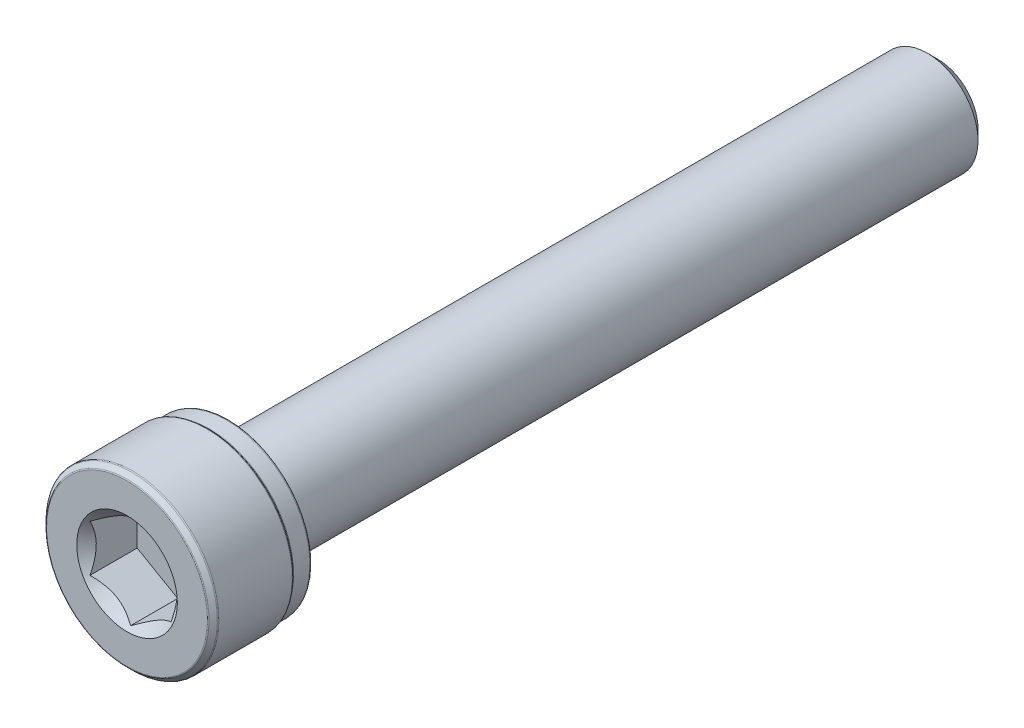
ISO-10303-21;
HEADER;
FILE_DESCRIPTION(('STEP AP214'),'2;1');
FILE_NAME('part.step','',(''),(''),'','','');
FILE_SCHEMA(('AUTOMOTIVE_DESIGN { 1 0 10303 214 1 1 1 1 }'));
ENDSEC;
DATA;
#1=APPLICATION_CONTEXT('core data for automotive mechanical design processes');
#2=APPLICATION_PROTOCOL_DEFINITION('international standard','automotive_design',2000,#1);
#3=PRODUCT_CONTEXT('',#1,'mechanical');
#4=PRODUCT('Part','Part','',(#3));
#5=PRODUCT_RELATED_PRODUCT_CATEGORY('part','',(#4));
#6=PRODUCT_DEFINITION_FORMATION('','',#4);
#7=PRODUCT_DEFINITION_CONTEXT('part definition',#1,'design');
#8=PRODUCT_DEFINITION('design','',#6,#7);
#9=PRODUCT_DEFINITION_SHAPE('','',#8);
#10=(LENGTH_UNIT() NAMED_UNIT(*) SI_UNIT(.MILLI.,.METRE.));
#11=(NAMED_UNIT(*) PLANE_ANGLE_UNIT() SI_UNIT($,.RADIAN.));
#12=(NAMED_UNIT(*) SI_UNIT($,.STERADIAN.) SOLID_ANGLE_UNIT());
#13=UNCERTAINTY_MEASURE_WITH_UNIT(LENGTH_MEASURE(1.E-05),#10,'distance_accuracy_value','');
#14=(GEOMETRIC_REPRESENTATION_CONTEXT(3) GLOBAL_UNCERTAINTY_ASSIGNED_CONTEXT((#13)) GLOBAL_UNIT_ASSIGNED_CONTEXT((#10,
#11,#12)) REPRESENTATION_CONTEXT('',''));
#15=CARTESIAN_POINT('',(0.,0.,0.));
#16=DIRECTION('',(0.,0.,1.));
#17=DIRECTION('',(1.,0.,0.));
#18=AXIS2_PLACEMENT_3D('',#15,#16,#17);
#19=CARTESIAN_POINT('',(0.,1.98038475772934,-20.));
#20=DIRECTION('',(0.,0.,-1.));
#21=DIRECTION('',(0.,1.,0.));
#22=AXIS2_PLACEMENT_3D('',#19,#20,#21);
#23=PLANE('',#22);
#24=CARTESIAN_POINT('',(0.,0.,-20.));
#25=DIRECTION('',(0.,0.,-1.));
#26=DIRECTION('',(0.,1.,0.));
#27=AXIS2_PLACEMENT_3D('',#24,#25,#26);
#28=CIRCLE('',#27,1.98038475772934);
#29=CARTESIAN_POINT('',(0.,1.98038475772934,-20.));
#30=VERTEX_POINT('',#29);
#31=EDGE_CURVE('E47',#30,#30,#28,.T.);
#32=ORIENTED_EDGE('',*,*,#31,.T.);
#33=EDGE_LOOP('',(#32));
#34=FACE_BOUND('',#33,.T.);
#35=ADVANCED_FACE('F34',(#34),#23,.T.);
#36=CARTESIAN_POINT('',(0.,0.,-20.));
#37=DIRECTION('',(0.,0.,1.));
#38=DIRECTION('',(0.,-1.,0.));
#39=AXIS2_PLACEMENT_3D('',#36,#37,#38);
#40=CONICAL_SURFACE('',#39,1.98038475772934,0.785398163397443);
#41=CARTESIAN_POINT('',(0.,0.,-19.4803847577293));
#42=DIRECTION('',(0.,0.,-1.));
#43=DIRECTION('',(0.,1.,0.));
#44=AXIS2_PLACEMENT_3D('',#41,#42,#43);
#45=CIRCLE('',#44,2.5);
#46=CARTESIAN_POINT('',(0.,2.5,-19.4803847577293));
#47=VERTEX_POINT('',#46);
#48=EDGE_CURVE('E153',#47,#47,#45,.T.);
#49=ORIENTED_EDGE('',*,*,#48,.T.);
#50=EDGE_LOOP('',(#49));
#51=FACE_BOUND('',#50,.T.);
#52=ORIENTED_EDGE('',*,*,#31,.F.);
#53=EDGE_LOOP('',(#52));
#54=FACE_BOUND('',#53,.T.);
#55=ADVANCED_FACE('F159',(#51,#54),#40,.T.);
#56=CARTESIAN_POINT('',(0.,0.,-20.));
#57=DIRECTION('',(0.,0.,-1.));
#58=DIRECTION('',(0.,1.,0.));
#59=AXIS2_PLACEMENT_3D('',#56,#57,#58);
#60=CYLINDRICAL_SURFACE('',#59,2.5);
#61=CARTESIAN_POINT('',(0.,0.,14.75));
#62=DIRECTION('',(0.,0.,-1.));
#63=DIRECTION('',(0.,1.,0.));
#64=AXIS2_PLACEMENT_3D('',#61,#62,#63);
#65=CIRCLE('',#64,2.5);
#66=CARTESIAN_POINT('',(0.,2.5,14.75));
#67=VERTEX_POINT('',#66);
#68=EDGE_CURVE('E150',#67,#67,#65,.T.);
#69=ORIENTED_EDGE('',*,*,#68,.T.);
#70=EDGE_LOOP('',(#69));
#71=FACE_BOUND('',#70,.T.);
#72=ORIENTED_EDGE('',*,*,#48,.F.);
#73=EDGE_LOOP('',(#72));
#74=FACE_BOUND('',#73,.T.);
#75=ADVANCED_FACE('F161',(#71,#74),#60,.T.);
#76=CARTESIAN_POINT('',(0.,0.,14.75));
#77=DIRECTION('',(0.,0.,-1.));
#78=DIRECTION('',(0.,1.,0.));
#79=AXIS2_PLACEMENT_3D('',#76,#77,#78);
#80=TOROIDAL_SURFACE('',#79,2.75,0.249999999999999);
#81=CARTESIAN_POINT('',(0.,0.,15.));
#82=DIRECTION('',(0.,0.,-1.));
#83=DIRECTION('',(0.,1.,0.));
#84=AXIS2_PLACEMENT_3D('',#81,#82,#83);
#85=CIRCLE('',#84,2.75);
#86=CARTESIAN_POINT('',(0.,2.75,15.));
#87=VERTEX_POINT('',#86);
#88=EDGE_CURVE('E147',#87,#87,#85,.T.);
#89=ORIENTED_EDGE('',*,*,#88,.T.);
#90=EDGE_LOOP('',(#89));
#91=FACE_BOUND('',#90,.T.);
#92=ORIENTED_EDGE('',*,*,#68,.F.);
#93=EDGE_LOOP('',(#92));
#94=FACE_BOUND('',#93,.T.);
#95=ADVANCED_FACE('F167',(#91,#94),#80,.F.);
#96=CARTESIAN_POINT('',(0.,4.01875,15.));
#97=DIRECTION('',(0.,0.,-1.));
#98=DIRECTION('',(0.,1.,0.));
#99=AXIS2_PLACEMENT_3D('',#96,#97,#98);
#100=PLANE('',#99);
#101=CARTESIAN_POINT('',(0.,0.,15.));
#102=DIRECTION('',(0.,0.,-1.));
#103=DIRECTION('',(0.,1.,0.));
#104=AXIS2_PLACEMENT_3D('',#101,#102,#103);
#105=CIRCLE('',#104,4.01875);
#106=CARTESIAN_POINT('',(0.,4.01875,15.));
#107=VERTEX_POINT('',#106);
#108=EDGE_CURVE('E144',#107,#107,#105,.T.);
#109=ORIENTED_EDGE('',*,*,#108,.T.);
#110=EDGE_LOOP('',(#109));
#111=FACE_BOUND('',#110,.T.);
#112=ORIENTED_EDGE('',*,*,#88,.F.);
#113=EDGE_LOOP('',(#112));
#114=FACE_BOUND('',#113,.T.);
#115=ADVANCED_FACE('F173',(#111,#114),#100,.T.);
#116=CARTESIAN_POINT('',(0.,0.,15.10625));
#117=DIRECTION('',(0.,0.,-1.));
#118=DIRECTION('',(0.,1.,0.));
#119=AXIS2_PLACEMENT_3D('',#116,#117,#118);
#120=TOROIDAL_SURFACE('',#119,4.01875,0.10625);
#121=CARTESIAN_POINT('',(0.,0.,15.10625));
#122=DIRECTION('',(0.,0.,-1.));
#123=DIRECTION('',(0.,1.,0.));
#124=AXIS2_PLACEMENT_3D('',#121,#122,#123);
#125=CIRCLE('',#124,4.125);
#126=CARTESIAN_POINT('',(0.,4.125,15.10625));
#127=VERTEX_POINT('',#126);
#128=EDGE_CURVE('E141',#127,#127,#125,.T.);
#129=ORIENTED_EDGE('',*,*,#128,.T.);
#130=EDGE_LOOP('',(#129));
#131=FACE_BOUND('',#130,.T.);
#132=ORIENTED_EDGE('',*,*,#108,.F.);
#133=EDGE_LOOP('',(#132));
#134=FACE_BOUND('',#133,.T.);
#135=ADVANCED_FACE('F177',(#131,#134),#120,.T.);
#136=CARTESIAN_POINT('',(0.,0.,-20.));
#137=DIRECTION('',(0.,0.,-1.));
#138=DIRECTION('',(0.,1.,0.));
#139=AXIS2_PLACEMENT_3D('',#136,#137,#138);
#140=CYLINDRICAL_SURFACE('',#139,4.125);
#141=CARTESIAN_POINT('',(0.,0.,15.9051395654396));
#142=DIRECTION('',(0.,0.,-1.));
#143=DIRECTION('',(0.,1.,0.));
#144=AXIS2_PLACEMENT_3D('',#141,#142,#143);
#145=CIRCLE('',#144,4.125);
#146=CARTESIAN_POINT('',(0.,4.125,15.9051395654396));
#147=VERTEX_POINT('',#146);
#148=EDGE_CURVE('E138',#147,#147,#145,.T.);
#149=ORIENTED_EDGE('',*,*,#148,.T.);
#150=EDGE_LOOP('',(#149));
#151=FACE_BOUND('',#150,.T.);
#152=ORIENTED_EDGE('',*,*,#128,.F.);
#153=EDGE_LOOP('',(#152));
#154=FACE_BOUND('',#153,.T.);
#155=ADVANCED_FACE('F181',(#151,#154),#140,.T.);
#156=CARTESIAN_POINT('',(0.,0.,15.9051395654396));
#157=DIRECTION('',(0.,0.,-1.));
#158=DIRECTION('',(0.,1.,0.));
#159=AXIS2_PLACEMENT_3D('',#156,#157,#158);
#160=TOROIDAL_SURFACE('',#159,4.203125,0.0781249999999984);
#161=CARTESIAN_POINT('',(0.,0.,15.9603822827198));
#162=DIRECTION('',(0.,0.,-1.));
#163=DIRECTION('',(0.,1.,0.));
#164=AXIS2_PLACEMENT_3D('',#161,#162,#163);
#165=CIRCLE('',#164,4.14788228271981);
#166=CARTESIAN_POINT('',(0.,4.14788228271981,15.9603822827198));
#167=VERTEX_POINT('',#166);
#168=EDGE_CURVE('E135',#167,#167,#165,.T.);
#169=ORIENTED_EDGE('',*,*,#168,.T.);
#170=EDGE_LOOP('',(#169));
#171=FACE_BOUND('',#170,.T.);
#172=ORIENTED_EDGE('',*,*,#148,.F.);
#173=EDGE_LOOP('',(#172));
#174=FACE_BOUND('',#173,.T.);
#175=ADVANCED_FACE('F185',(#171,#174),#160,.F.);
#176=CARTESIAN_POINT('',(0.,0.,15.9603822827198));
#177=DIRECTION('',(0.,0.,1.));
#178=DIRECTION('',(0.,-1.,0.));
#179=AXIS2_PLACEMENT_3D('',#176,#177,#178);
#180=CONICAL_SURFACE('',#179,4.14788228271981,0.785398163397405);
#181=CARTESIAN_POINT('',(0.,0.,16.0396177172802));
#182=DIRECTION('',(0.,0.,-1.));
#183=DIRECTION('',(0.,1.,0.));
#184=AXIS2_PLACEMENT_3D('',#181,#182,#183);
#185=CIRCLE('',#184,4.2271177172802);
#186=CARTESIAN_POINT('',(0.,4.2271177172802,16.0396177172802));
#187=VERTEX_POINT('',#186);
#188=EDGE_CURVE('E132',#187,#187,#185,.T.);
#189=ORIENTED_EDGE('',*,*,#188,.T.);
#190=EDGE_LOOP('',(#189));
#191=FACE_BOUND('',#190,.T.);
#192=ORIENTED_EDGE('',*,*,#168,.F.);
#193=EDGE_LOOP('',(#192));
#194=FACE_BOUND('',#193,.T.);
#195=ADVANCED_FACE('F189',(#191,#194),#180,.T.);
#196=CARTESIAN_POINT('',(0.,0.,16.0948604345604));
#197=DIRECTION('',(0.,0.,-1.));
#198=DIRECTION('',(0.,1.,0.));
#199=AXIS2_PLACEMENT_3D('',#196,#197,#198);
#200=TOROIDAL_SURFACE('',#199,4.171875,0.0781249999999984);
#201=CARTESIAN_POINT('',(0.,0.,16.0948604345604));
#202=DIRECTION('',(0.,0.,-1.));
#203=DIRECTION('',(0.,1.,0.));
#204=AXIS2_PLACEMENT_3D('',#201,#202,#203);
#205=CIRCLE('',#204,4.25);
#206=CARTESIAN_POINT('',(0.,4.25,16.0948604345604));
#207=VERTEX_POINT('',#206);
#208=EDGE_CURVE('E129',#207,#207,#205,.T.);
#209=ORIENTED_EDGE('',*,*,#208,.T.);
#210=EDGE_LOOP('',(#209));
#211=FACE_BOUND('',#210,.T.);
#212=ORIENTED_EDGE('',*,*,#188,.F.);
#213=EDGE_LOOP('',(#212));
#214=FACE_BOUND('',#213,.T.);
#215=ADVANCED_FACE('F193',(#211,#214),#200,.T.);
#216=CARTESIAN_POINT('',(0.,0.,-20.));
#217=DIRECTION('',(0.,0.,-1.));
#218=DIRECTION('',(0.,1.,0.));
#219=AXIS2_PLACEMENT_3D('',#216,#217,#218);
#220=CYLINDRICAL_SURFACE('',#219,4.25);
#221=CARTESIAN_POINT('',(0.,0.,19.7176395654396));
#222=DIRECTION('',(0.,0.,-1.));
#223=DIRECTION('',(0.,1.,0.));
#224=AXIS2_PLACEMENT_3D('',#221,#222,#223);
#225=CIRCLE('',#224,4.25);
#226=CARTESIAN_POINT('',(0.,4.25,19.7176395654396));
#227=VERTEX_POINT('',#226);
#228=EDGE_CURVE('E126',#227,#227,#225,.T.);
#229=ORIENTED_EDGE('',*,*,#228,.T.);
#230=EDGE_LOOP('',(#229));
#231=FACE_BOUND('',#230,.T.);
#232=ORIENTED_EDGE('',*,*,#208,.F.);
#233=EDGE_LOOP('',(#232));
#234=FACE_BOUND('',#233,.T.);
#235=ADVANCED_FACE('F197',(#231,#234),#220,.T.);
#236=CARTESIAN_POINT('',(0.,0.,19.7176395654396));
#237=DIRECTION('',(0.,0.,-1.));
#238=DIRECTION('',(0.,1.,0.));
#239=AXIS2_PLACEMENT_3D('',#236,#237,#238);
#240=TOROIDAL_SURFACE('',#239,4.171875,0.0781250000000014);
#241=CARTESIAN_POINT('',(0.,0.,19.7728822827198));
#242=DIRECTION('',(0.,0.,-1.));
#243=DIRECTION('',(0.,1.,0.));
#244=AXIS2_PLACEMENT_3D('',#241,#242,#243);
#245=CIRCLE('',#244,4.2271177172802);
#246=CARTESIAN_POINT('',(0.,4.2271177172802,19.7728822827198));
#247=VERTEX_POINT('',#246);
#248=EDGE_CURVE('E123',#247,#247,#245,.T.);
#249=ORIENTED_EDGE('',*,*,#248,.T.);
#250=EDGE_LOOP('',(#249));
#251=FACE_BOUND('',#250,.T.);
#252=ORIENTED_EDGE('',*,*,#228,.F.);
#253=EDGE_LOOP('',(#252));
#254=FACE_BOUND('',#253,.T.);
#255=ADVANCED_FACE('F201',(#251,#254),#240,.T.);
#256=CARTESIAN_POINT('',(0.,0.,19.7728822827198));
#257=DIRECTION('',(0.,0.,-1.));
#258=DIRECTION('',(0.,1.,0.));
#259=AXIS2_PLACEMENT_3D('',#256,#257,#258);
#260=CONICAL_SURFACE('',#259,4.2271177172802,0.785398163397474);
#261=CARTESIAN_POINT('',(0.,0.,19.9771177172802));
#262=DIRECTION('',(0.,0.,-1.));
#263=DIRECTION('',(0.,1.,0.));
#264=AXIS2_PLACEMENT_3D('',#261,#262,#263);
#265=CIRCLE('',#264,4.0228822827198);
#266=CARTESIAN_POINT('',(0.,4.0228822827198,19.9771177172802));
#267=VERTEX_POINT('',#266);
#268=EDGE_CURVE('E120',#267,#267,#265,.T.);
#269=ORIENTED_EDGE('',*,*,#268,.T.);
#270=EDGE_LOOP('',(#269));
#271=FACE_BOUND('',#270,.T.);
#272=ORIENTED_EDGE('',*,*,#248,.F.);
#273=EDGE_LOOP('',(#272));
#274=FACE_BOUND('',#273,.T.);
#275=ADVANCED_FACE('F205',(#271,#274),#260,.T.);
#276=CARTESIAN_POINT('',(0.,0.,19.921875));
#277=DIRECTION('',(0.,0.,-1.));
#278=DIRECTION('',(0.,1.,0.));
#279=AXIS2_PLACEMENT_3D('',#276,#277,#278);
#280=TOROIDAL_SURFACE('',#279,3.9676395654396,0.0781249999999981);
#281=CARTESIAN_POINT('',(0.,0.,20.));
#282=DIRECTION('',(0.,0.,-1.));
#283=DIRECTION('',(0.,1.,0.));
#284=AXIS2_PLACEMENT_3D('',#281,#282,#283);
#285=CIRCLE('',#284,3.9676395654396);
#286=CARTESIAN_POINT('',(0.,3.9676395654396,20.));
#287=VERTEX_POINT('',#286);
#288=EDGE_CURVE('E117',#287,#287,#285,.T.);
#289=ORIENTED_EDGE('',*,*,#288,.T.);
#290=EDGE_LOOP('',(#289));
#291=FACE_BOUND('',#290,.T.);
#292=ORIENTED_EDGE('',*,*,#268,.F.);
#293=EDGE_LOOP('',(#292));
#294=FACE_BOUND('',#293,.T.);
#295=ADVANCED_FACE('F209',(#291,#294),#280,.T.);
#296=CARTESIAN_POINT('',(0.,0.,20.));
#297=DIRECTION('',(0.,0.,1.));
#298=DIRECTION('',(0.,-1.,0.));
#299=AXIS2_PLACEMENT_3D('',#296,#297,#298);
#300=PLANE('',#299);
#301=CARTESIAN_POINT('',(0.,0.,20.));
#302=DIRECTION('',(0.,0.,1.));
#303=DIRECTION('',(1.,0.,0.));
#304=AXIS2_PLACEMENT_3D('',#301,#302,#303);
#305=CIRCLE('',#304,2.48260615751539);
#306=CARTESIAN_POINT('',(2.48260615751539,0.,20.));
#307=VERTEX_POINT('',#306);
#308=EDGE_CURVE('E303',#307,#307,#305,.T.);
#309=ORIENTED_EDGE('',*,*,#308,.F.);
#310=EDGE_LOOP('',(#309));
#311=FACE_BOUND('',#310,.T.);
#312=ORIENTED_EDGE('',*,*,#288,.F.);
#313=EDGE_LOOP('',(#312));
#314=FACE_BOUND('',#313,.T.);
#315=ADVANCED_FACE('F213',(#311,#314),#300,.T.);
#316=CARTESIAN_POINT('',(0.,0.,20.));
#317=DIRECTION('',(0.,0.,1.));
#318=DIRECTION('',(1.,0.,0.));
#319=AXIS2_PLACEMENT_3D('',#316,#317,#318);
#320=CONICAL_SURFACE('',#319,2.48260615751539,0.78539816339745);
#321=ORIENTED_EDGE('',*,*,#308,.T.);
#322=EDGE_LOOP('',(#321));
#323=FACE_BOUND('',#322,.T.);
#324=CARTESIAN_POINT('',(-2.00019999999999,-1.15458506832541,19.8269103979568));
#325=CARTESIAN_POINT('',(-1.93144696596929,-1.19427965103064,19.7872480094687));
#326=CARTESIAN_POINT('',(-1.86154425786448,-1.23463799837204,19.7499149015273));
#327=CARTESIAN_POINT('',(-1.71900475544956,-1.31693321846145,19.6815586043793));
#328=CARTESIAN_POINT('',(-1.64635440243464,-1.35887791933134,19.6505734529803));
#329=CARTESIAN_POINT('',(-1.49985839894603,-1.44345742638069,19.5974951357873));
#330=CARTESIAN_POINT('',(-1.4260500647537,-1.48607068799507,19.5752685464197));
#331=CARTESIAN_POINT('',(-1.27680836816473,-1.57223542169502,19.5410237359182));
#332=CARTESIAN_POINT('',(-1.20137956608185,-1.61578426088223,19.5289799483873));
#333=CARTESIAN_POINT('',(-1.07138449932892,-1.69083694766535,19.5181134311487));
#334=CARTESIAN_POINT('',(-1.01698621602989,-1.7222438111715,19.5165046728531));
#335=CARTESIAN_POINT('',(-0.908278544480305,-1.78500621460363,19.5192137968418));
#336=CARTESIAN_POINT('',(-0.85396919407866,-1.81636173267754,19.5235337570011));
#337=CARTESIAN_POINT('',(-0.745863272410661,-1.87877671565355,19.537854486653));
#338=CARTESIAN_POINT('',(-0.692067343445207,-1.90983580972306,19.5478616120051));
#339=CARTESIAN_POINT('',(-0.585405737694426,-1.97141691651547,19.5730073494928));
#340=CARTESIAN_POINT('',(-0.532539989929287,-2.00193897021858,19.5881455682854));
#341=CARTESIAN_POINT('',(-0.397120266910156,-2.08012358375726,19.6330894226723));
#342=CARTESIAN_POINT('',(-0.315406165150521,-2.12730124240478,19.6662837586689));
#343=CARTESIAN_POINT('',(-0.195252962742197,-2.19667172615922,19.7223207424145));
#344=CARTESIAN_POINT('',(-0.155657147890822,-2.21953238052244,19.7420096221901));
#345=CARTESIAN_POINT('',(-0.0771990411121269,-2.26483018959123,19.783182237608));
#346=CARTESIAN_POINT('',(-0.0383363164062586,-2.28726759416161,19.8046648708944));
#347=CARTESIAN_POINT('',(0.000200000000000734,-2.30951654681234,19.8269103979568));
#348=B_SPLINE_CURVE_WITH_KNOTS('',3,(#324,#325,#326,#327,#328,#329,#330,#331,#332,#333,#334,
#335,#336,#337,#338,#339,#340,#341,#342,#343,#344,#345,#346,#347),.UNSPECIFIED.,.F.,.F.,(4,2,2,
2,2,2,2,2,2,2,2,4),(0.,0.266420613771062,0.534393751523386,0.79811037437691,1.06116288956936,
1.24939906803721,1.43770123566247,1.62621426093931,1.81471283831913,2.11415604834144,
2.2634717071779,2.4126962696977),.UNSPECIFIED.);
#349=CARTESIAN_POINT('',(-1.99999999999999,-1.15470053837925,19.8267949192431));
#350=VERTEX_POINT('',#349);
#351=CARTESIAN_POINT('',(0.,-2.3094010767585,19.8267949192431));
#352=VERTEX_POINT('',#351);
#353=EDGE_CURVE('E101',#350,#352,#348,.T.);
#354=ORIENTED_EDGE('',*,*,#353,.F.);
#355=CARTESIAN_POINT('',(-1.99999999999999,-2.42398175579867,20.6599545105457));
#356=CARTESIAN_POINT('',(-1.99999999999999,-2.3654738763041,20.6148351758713));
#357=CARTESIAN_POINT('',(-1.99999999999999,-2.30665236661134,20.5701161756265));
#358=CARTESIAN_POINT('',(-1.99999999999999,-2.18825331969084,20.4816622121418));
#359=CARTESIAN_POINT('',(-1.99999999999999,-2.12867560822125,20.4379274823771));
#360=CARTESIAN_POINT('',(-1.99999999999999,-2.00820019262835,20.3513142462896));
#361=CARTESIAN_POINT('',(-1.99999999999999,-1.94729585350119,20.3084449389484));
#362=CARTESIAN_POINT('',(-1.99999999999999,-1.82447635639411,20.2241846501668));
#363=CARTESIAN_POINT('',(-1.99999999999999,-1.7625612682339,20.1827935672392));
#364=CARTESIAN_POINT('',(-1.99999999999999,-1.63352305153315,20.0992199648467));
#365=CARTESIAN_POINT('',(-1.99999999999999,-1.56632133333278,20.0571581799355));
#366=CARTESIAN_POINT('',(-1.99999999999999,-1.43035896394452,19.9756383889365));
#367=CARTESIAN_POINT('',(-1.99999999999999,-1.36159851701449,19.9361800443101));
#368=CARTESIAN_POINT('',(-1.99999999999999,-1.22246684398891,19.8606863637627));
#369=CARTESIAN_POINT('',(-1.99999999999999,-1.15210085009343,19.8246414605252));
#370=CARTESIAN_POINT('',(-1.99999999999999,-1.00937086384545,19.7567889383446));
#371=CARTESIAN_POINT('',(-1.99999999999999,-0.937007838648197,19.724979310286));
#372=CARTESIAN_POINT('',(-1.99999999999999,-0.797532850709091,19.6696918996687));
#373=CARTESIAN_POINT('',(-1.99999999999999,-0.730627867984566,19.6456972616385));
#374=CARTESIAN_POINT('',(-1.99999999999999,-0.595101218410186,19.6030621374066));
#375=CARTESIAN_POINT('',(-2.,-0.526479443554561,19.5844219889886));
#376=CARTESIAN_POINT('',(-2.,-0.389131528451129,19.5538205255166));
#377=CARTESIAN_POINT('',(-2.,-0.320433088583211,19.5417369815865));
#378=CARTESIAN_POINT('',(-2.,-0.182167175628635,19.5245029259217));
#379=CARTESIAN_POINT('',(-2.,-0.112599890436881,19.5193509405131));
#380=CARTESIAN_POINT('',(-2.,0.0235742388197043,19.5164261236486));
#381=CARTESIAN_POINT('',(-2.,0.0901742622543217,19.5183334186349));
#382=CARTESIAN_POINT('',(-2.,0.222860647279179,19.5286844259992));
#383=CARTESIAN_POINT('',(-2.,0.288946962142556,19.537128726115));
#384=CARTESIAN_POINT('',(-2.,0.421249515605841,19.5602169544548));
#385=CARTESIAN_POINT('',(-2.,0.487446247340618,19.574970869731));
#386=CARTESIAN_POINT('',(-2.,0.618375539180379,19.6098579982816));
#387=CARTESIAN_POINT('',(-2.,0.683108176846777,19.6299909258717));
#388=CARTESIAN_POINT('',(-2.,0.881750195572361,19.699485149858));
#389=CARTESIAN_POINT('',(-2.,1.01295821830486,19.7565400033525));
#390=CARTESIAN_POINT('',(-2.,1.26925973679031,19.8835183967961));
#391=CARTESIAN_POINT('',(-2.,1.39432972284544,19.9534871660011));
#392=CARTESIAN_POINT('',(-2.,1.57512870977373,20.0627644548654));
#393=CARTESIAN_POINT('',(-2.,1.63281357796871,20.0989012241787));
#394=CARTESIAN_POINT('',(-2.,1.74719269140407,20.1727216099303));
#395=CARTESIAN_POINT('',(-2.,1.80388686201492,20.2104053421917));
#396=CARTESIAN_POINT('',(-2.,1.91595826038668,20.2867305219709));
#397=CARTESIAN_POINT('',(-2.,1.97134240267411,20.3253618677048));
#398=CARTESIAN_POINT('',(-2.,2.08135060816027,20.4036615543687));
#399=CARTESIAN_POINT('',(-2.,2.13597487670731,20.4433296064566));
#400=CARTESIAN_POINT('',(-2.,2.19028039622781,20.4834228737147));
#401=B_SPLINE_CURVE_WITH_KNOTS('',3,(#355,#356,#357,#358,#359,#360,#361,#362,#363,#364,#365,
#366,#367,#368,#369,#370,#371,#372,#373,#374,#375,#376,#377,#378,#379,#380,#381,#382,#383,#384,
#385,#386,#387,#388,#389,#390,#391,#392,#393,#394,#395,#396,#397,#398,#399,#400),.UNSPECIFIED.,
.F.,.F.,(4,2,2,2,2,2,2,2,2,2,2,2,2,2,2,2,2,2,2,2,2,2,4),(0.,0.22165766710034,0.443367370127321,
0.666786125723381,0.890189512941436,1.12798201434515,1.36574353320623,1.60281759521649,
1.83977879106022,2.05282811904837,2.26589088413716,2.47483185958036,2.68372840641277,
2.88327763021217,3.08284479743511,3.2860424244889,3.48922926167213,3.91721633282415,
4.34673183999752,4.55091998635567,4.75512344852469,4.95768958131485,5.16019986543558),.UNSPECIFIED.);
#402=CARTESIAN_POINT('',(-2.,1.15470053837925,19.8267949192431));
#403=VERTEX_POINT('',#402);
#404=EDGE_CURVE('E259',#403,#350,#401,.F.);
#405=ORIENTED_EDGE('',*,*,#404,.F.);
#406=CARTESIAN_POINT('',(0.000200000000000542,2.30951654681234,19.8269103979568));
#407=CARTESIAN_POINT('',(-0.0685530340307045,2.2698219641071,19.7872480094687));
#408=CARTESIAN_POINT('',(-0.13845574213551,2.22946361676571,19.7499149015273));
#409=CARTESIAN_POINT('',(-0.280995244550436,2.1471683966763,19.6815586043793));
#410=CARTESIAN_POINT('',(-0.353645597565358,2.10522369580641,19.6505734529803));
#411=CARTESIAN_POINT('',(-0.50014160105397,2.02064418875706,19.5974951357873));
#412=CARTESIAN_POINT('',(-0.573949935246293,1.97803092714268,19.5752685464197));
#413=CARTESIAN_POINT('',(-0.723191631835262,1.89186619344272,19.5410237359182));
#414=CARTESIAN_POINT('',(-0.79862043391815,1.84831735425552,19.5289799483873));
#415=CARTESIAN_POINT('',(-0.928615500671077,1.77326466747239,19.5181134311487));
#416=CARTESIAN_POINT('',(-0.983013783970106,1.74185780396624,19.5165046728531));
#417=CARTESIAN_POINT('',(-1.09172145551969,1.67909540053411,19.5192137968418));
#418=CARTESIAN_POINT('',(-1.14603080592134,1.64773988246021,19.5235337570011));
#419=CARTESIAN_POINT('',(-1.25413672758934,1.5853248994842,19.537854486653));
#420=CARTESIAN_POINT('',(-1.30793265655479,1.55426580541469,19.5478616120051));
#421=CARTESIAN_POINT('',(-1.41459426230557,1.49268469862228,19.5730073494928));
#422=CARTESIAN_POINT('',(-1.46746001007071,1.46216264491916,19.5881455682854));
#423=CARTESIAN_POINT('',(-1.60287973308984,1.38397803138048,19.6330894226723));
#424=CARTESIAN_POINT('',(-1.68459383484948,1.33680037273297,19.6662837586689));
#425=CARTESIAN_POINT('',(-1.8047470372578,1.26742988897853,19.7223207424145));
#426=CARTESIAN_POINT('',(-1.84434285210917,1.2445692346153,19.7420096221901));
#427=CARTESIAN_POINT('',(-1.92280095888787,1.19927142554652,19.783182237608));
#428=CARTESIAN_POINT('',(-1.96166368359374,1.17683402097614,19.8046648708944));
#429=CARTESIAN_POINT('',(-2.0002,1.15458506832541,19.8269103979568));
#430=B_SPLINE_CURVE_WITH_KNOTS('',3,(#406,#407,#408,#409,#410,#411,#412,#413,#414,#415,#416,
#417,#418,#419,#420,#421,#422,#423,#424,#425,#426,#427,#428,#429),.UNSPECIFIED.,.F.,.F.,(4,2,2,
2,2,2,2,2,2,2,2,4),(0.,0.266420613771063,0.534393751523387,0.798110374376912,1.06116288956936,
1.24939906803721,1.43770123566247,1.62621426093931,1.81471283831913,2.11415604834144,
2.2634717071779,2.4126962696977),.UNSPECIFIED.);
#431=CARTESIAN_POINT('',(0.,2.3094010767585,19.8267949192431));
#432=VERTEX_POINT('',#431);
#433=EDGE_CURVE('E253',#432,#403,#430,.T.);
#434=ORIENTED_EDGE('',*,*,#433,.F.);
#435=CARTESIAN_POINT('',(2.0002,1.15458506832541,19.8269103979568));
#436=CARTESIAN_POINT('',(1.9314469659693,1.19427965103064,19.7872480094687));
#437=CARTESIAN_POINT('',(1.86154425786449,1.23463799837204,19.7499149015273));
#438=CARTESIAN_POINT('',(1.71900475544956,1.31693321846145,19.6815586043793));
#439=CARTESIAN_POINT('',(1.64635440243464,1.35887791933133,19.6505734529803));
#440=CARTESIAN_POINT('',(1.49985839894603,1.44345742638069,19.5974951357873));
#441=CARTESIAN_POINT('',(1.42605006475371,1.48607068799506,19.5752685464197));
#442=CARTESIAN_POINT('',(1.27680836816474,1.57223542169502,19.5410237359182));
#443=CARTESIAN_POINT('',(1.20137956608185,1.61578426088223,19.5289799483873));
#444=CARTESIAN_POINT('',(1.07138449932892,1.69083694766536,19.5181134311487));
#445=CARTESIAN_POINT('',(1.01698621602989,1.7222438111715,19.5165046728531));
#446=CARTESIAN_POINT('',(0.908278544480305,1.78500621460363,19.5192137968418));
#447=CARTESIAN_POINT('',(0.853969194078659,1.81636173267754,19.5235337570011));
#448=CARTESIAN_POINT('',(0.74586327241066,1.87877671565355,19.537854486653));
#449=CARTESIAN_POINT('',(0.692067343445207,1.90983580972306,19.5478616120051));
#450=CARTESIAN_POINT('',(0.585405737694425,1.97141691651547,19.5730073494928));
#451=CARTESIAN_POINT('',(0.532539989929286,2.00193897021859,19.5881455682854));
#452=CARTESIAN_POINT('',(0.397120266910155,2.08012358375726,19.6330894226723));
#453=CARTESIAN_POINT('',(0.315406165150521,2.12730124240478,19.6662837586689));
#454=CARTESIAN_POINT('',(0.195252962742197,2.19667172615922,19.7223207424145));
#455=CARTESIAN_POINT('',(0.155657147890822,2.21953238052244,19.7420096221901));
#456=CARTESIAN_POINT('',(0.077199041112128,2.26483018959123,19.783182237608));
#457=CARTESIAN_POINT('',(0.0383363164062604,2.28726759416161,19.8046648708944));
#458=CARTESIAN_POINT('',(-0.00019999999999857,2.30951654681234,19.8269103979568));
#459=B_SPLINE_CURVE_WITH_KNOTS('',3,(#435,#436,#437,#438,#439,#440,#441,#442,#443,#444,#445,
#446,#447,#448,#449,#450,#451,#452,#453,#454,#455,#456,#457,#458),.UNSPECIFIED.,.F.,.F.,(4,2,2,
2,2,2,2,2,2,2,2,4),(0.,0.266420613771063,0.534393751523388,0.798110374376914,1.06116288956937,
1.24939906803722,1.43770123566248,1.62621426093932,1.81471283831913,2.11415604834145,
2.2634717071779,2.4126962696977),.UNSPECIFIED.);
#460=CARTESIAN_POINT('',(2.,1.15470053837925,19.8267949192431));
#461=VERTEX_POINT('',#460);
#462=EDGE_CURVE('E54',#461,#432,#459,.T.);
#463=ORIENTED_EDGE('',*,*,#462,.F.);
#464=CARTESIAN_POINT('',(2.,-2.42398175579867,20.6599545105457));
#465=CARTESIAN_POINT('',(2.,-2.36547387630409,20.6148351758713));
#466=CARTESIAN_POINT('',(2.,-2.30665236661134,20.5701161756265));
#467=CARTESIAN_POINT('',(2.,-2.18825331969083,20.4816622121418));
#468=CARTESIAN_POINT('',(2.,-2.12867560822124,20.4379274823771));
#469=CARTESIAN_POINT('',(2.,-2.00820019262834,20.3513142462896));
#470=CARTESIAN_POINT('',(2.,-1.94729585350118,20.3084449389484));
#471=CARTESIAN_POINT('',(2.,-1.82447635639411,20.2241846501668));
#472=CARTESIAN_POINT('',(2.,-1.7625612682339,20.1827935672392));
#473=CARTESIAN_POINT('',(2.,-1.63352305153314,20.0992199648467));
#474=CARTESIAN_POINT('',(2.,-1.56632133333277,20.0571581799355));
#475=CARTESIAN_POINT('',(2.,-1.43035896394452,19.9756383889365));
#476=CARTESIAN_POINT('',(2.,-1.36159851701449,19.9361800443101));
#477=CARTESIAN_POINT('',(2.,-1.22246684398891,19.8606863637627));
#478=CARTESIAN_POINT('',(2.,-1.15210085009343,19.8246414605252));
#479=CARTESIAN_POINT('',(2.,-1.00937086384545,19.7567889383447));
#480=CARTESIAN_POINT('',(2.,-0.937007838648193,19.724979310286));
#481=CARTESIAN_POINT('',(2.,-0.797532850709088,19.6696918996687));
#482=CARTESIAN_POINT('',(2.,-0.730627867984562,19.6456972616385));
#483=CARTESIAN_POINT('',(2.,-0.595101218410182,19.6030621374066));
#484=CARTESIAN_POINT('',(2.,-0.526479443554558,19.5844219889886));
#485=CARTESIAN_POINT('',(2.,-0.389131528451127,19.5538205255166));
#486=CARTESIAN_POINT('',(2.,-0.320433088583209,19.5417369815865));
#487=CARTESIAN_POINT('',(2.,-0.182167175628632,19.5245029259217));
#488=CARTESIAN_POINT('',(2.,-0.112599890436879,19.5193509405131));
#489=CARTESIAN_POINT('',(2.,0.0235742388197073,19.5164261236486));
#490=CARTESIAN_POINT('',(2.,0.090174262254325,19.5183334186349));
#491=CARTESIAN_POINT('',(2.,0.222860647279182,19.5286844259992));
#492=CARTESIAN_POINT('',(2.,0.288946962142559,19.537128726115));
#493=CARTESIAN_POINT('',(2.,0.421249515605844,19.5602169544548));
#494=CARTESIAN_POINT('',(2.,0.487446247340621,19.574970869731));
#495=CARTESIAN_POINT('',(2.,0.618375539180382,19.6098579982816));
#496=CARTESIAN_POINT('',(2.,0.68310817684678,19.6299909258717));
#497=CARTESIAN_POINT('',(2.,0.881750195572363,19.699485149858));
#498=CARTESIAN_POINT('',(2.,1.01295821830486,19.7565400033525));
#499=CARTESIAN_POINT('',(2.,1.26925973679032,19.8835183967961));
#500=CARTESIAN_POINT('',(2.,1.39432972284545,19.9534871660011));
#501=CARTESIAN_POINT('',(2.,1.57512870977373,20.0627644548654));
#502=CARTESIAN_POINT('',(2.,1.63281357796872,20.0989012241787));
#503=CARTESIAN_POINT('',(2.,1.74719269140407,20.1727216099303));
#504=CARTESIAN_POINT('',(2.,1.80388686201493,20.2104053421917));
#505=CARTESIAN_POINT('',(2.,1.91595826038669,20.2867305219709));
#506=CARTESIAN_POINT('',(2.,1.97134240267412,20.3253618677048));
#507=CARTESIAN_POINT('',(2.,2.08135060816028,20.4036615543687));
#508=CARTESIAN_POINT('',(2.,2.13597487670732,20.4433296064566));
#509=CARTESIAN_POINT('',(2.,2.19028039622782,20.4834228737147));
#510=B_SPLINE_CURVE_WITH_KNOTS('',3,(#464,#465,#466,#467,#468,#469,#470,#471,#472,#473,#474,
#475,#476,#477,#478,#479,#480,#481,#482,#483,#484,#485,#486,#487,#488,#489,#490,#491,#492,#493,
#494,#495,#496,#497,#498,#499,#500,#501,#502,#503,#504,#505,#506,#507,#508,#509),.UNSPECIFIED.,
.F.,.F.,(4,2,2,2,2,2,2,2,2,2,2,2,2,2,2,2,2,2,2,2,2,2,4),(0.,0.22165766710034,0.443367370127321,
0.666786125723381,0.890189512941437,1.12798201434514,1.36574353320623,1.60281759521648,
1.83977879106022,2.05282811904837,2.26589088413716,2.47483185958035,2.68372840641276,
2.88327763021217,3.08284479743511,3.2860424244889,3.48922926167212,3.91721633282414,
4.34673183999751,4.55091998635567,4.75512344852469,4.95768958131485,5.16019986543558),.UNSPECIFIED.);
#511=CARTESIAN_POINT('',(2.,-1.15470053837925,19.8267949192431));
#512=VERTEX_POINT('',#511);
#513=EDGE_CURVE('E12',#512,#461,#510,.T.);
#514=ORIENTED_EDGE('',*,*,#513,.F.);
#515=CARTESIAN_POINT('',(-0.000199999999999496,-2.30951654681234,19.8269103979568));
#516=CARTESIAN_POINT('',(0.0685530340307065,-2.26982196410711,19.7872480094687));
#517=CARTESIAN_POINT('',(0.138455742135512,-2.22946361676571,19.7499149015273));
#518=CARTESIAN_POINT('',(0.280995244550437,-2.1471683966763,19.6815586043793));
#519=CARTESIAN_POINT('',(0.353645597565358,-2.10522369580641,19.6505734529803));
#520=CARTESIAN_POINT('',(0.500141601053971,-2.02064418875706,19.5974951357873));
#521=CARTESIAN_POINT('',(0.573949935246294,-1.97803092714268,19.5752685464197));
#522=CARTESIAN_POINT('',(0.723191631835264,-1.89186619344273,19.5410237359182));
#523=CARTESIAN_POINT('',(0.798620433918152,-1.84831735425552,19.5289799483873));
#524=CARTESIAN_POINT('',(0.928615500671079,-1.77326466747239,19.5181134311487));
#525=CARTESIAN_POINT('',(0.983013783970108,-1.74185780396624,19.5165046728531));
#526=CARTESIAN_POINT('',(1.09172145551969,-1.67909540053411,19.5192137968418));
#527=CARTESIAN_POINT('',(1.14603080592134,-1.64773988246021,19.5235337570011));
#528=CARTESIAN_POINT('',(1.25413672758934,-1.5853248994842,19.537854486653));
#529=CARTESIAN_POINT('',(1.30793265655479,-1.55426580541469,19.5478616120051));
#530=CARTESIAN_POINT('',(1.41459426230557,-1.49268469862228,19.5730073494928));
#531=CARTESIAN_POINT('',(1.46746001007071,-1.46216264491916,19.5881455682854));
#532=CARTESIAN_POINT('',(1.60287973308984,-1.38397803138048,19.6330894226723));
#533=CARTESIAN_POINT('',(1.68459383484948,-1.33680037273297,19.6662837586689));
#534=CARTESIAN_POINT('',(1.8047470372578,-1.26742988897853,19.7223207424145));
#535=CARTESIAN_POINT('',(1.84434285210918,-1.2445692346153,19.7420096221901));
#536=CARTESIAN_POINT('',(1.92280095888787,-1.19927142554652,19.783182237608));
#537=CARTESIAN_POINT('',(1.96166368359374,-1.17683402097614,19.8046648708944));
#538=CARTESIAN_POINT('',(2.0002,-1.15458506832541,19.8269103979568));
#539=B_SPLINE_CURVE_WITH_KNOTS('',3,(#515,#516,#517,#518,#519,#520,#521,#522,#523,#524,#525,
#526,#527,#528,#529,#530,#531,#532,#533,#534,#535,#536,#537,#538),.UNSPECIFIED.,.F.,.F.,(4,2,2,
2,2,2,2,2,2,2,2,4),(0.,0.266420613771064,0.534393751523388,0.798110374376914,1.06116288956936,
1.24939906803722,1.43770123566247,1.62621426093931,1.81471283831913,2.11415604834145,
2.2634717071779,2.41269626969771),.UNSPECIFIED.);
#540=EDGE_CURVE('E92',#352,#512,#539,.T.);
#541=ORIENTED_EDGE('',*,*,#540,.F.);
#542=EDGE_LOOP('',(#354,#405,#434,#463,#514,#541));
#543=FACE_BOUND('',#542,.T.);
#544=ADVANCED_FACE('F91',(#323,#543),#320,.F.);
#545=CARTESIAN_POINT('',(0.,0.,17.5));
#546=DIRECTION('',(0.,0.,1.));
#547=DIRECTION('',(1.,0.,0.));
#548=AXIS2_PLACEMENT_3D('',#545,#546,#547);
#549=PLANE('',#548);
#550=DIRECTION('',(0.866025403784438,0.5,0.));
#551=VECTOR('',#550,1.);
#552=CARTESIAN_POINT('',(0.,-2.3094010767585,17.5));
#553=LINE('',#552,#551);
#554=CARTESIAN_POINT('',(0.,-2.3094010767585,17.5));
#555=VERTEX_POINT('',#554);
#556=CARTESIAN_POINT('',(2.,-1.15470053837925,17.5));
#557=VERTEX_POINT('',#556);
#558=EDGE_CURVE('E100',#555,#557,#553,.T.);
#559=ORIENTED_EDGE('',*,*,#558,.T.);
#560=DIRECTION('',(0.,1.,0.));
#561=VECTOR('',#560,1.);
#562=CARTESIAN_POINT('',(2.,-1.15470053837925,17.5));
#563=LINE('',#562,#561);
#564=CARTESIAN_POINT('',(2.,1.15470053837925,17.5));
#565=VERTEX_POINT('',#564);
#566=EDGE_CURVE('E105',#557,#565,#563,.T.);
#567=ORIENTED_EDGE('',*,*,#566,.T.);
#568=DIRECTION('',(-0.866025403784439,0.499999999999999,0.));
#569=VECTOR('',#568,1.);
#570=CARTESIAN_POINT('',(2.,1.15470053837925,17.5));
#571=LINE('',#570,#569);
#572=CARTESIAN_POINT('',(0.,2.3094010767585,17.5));
#573=VERTEX_POINT('',#572);
#574=EDGE_CURVE('E285',#565,#573,#571,.T.);
#575=ORIENTED_EDGE('',*,*,#574,.T.);
#576=DIRECTION('',(-0.866025403784439,-0.5,0.));
#577=VECTOR('',#576,1.);
#578=CARTESIAN_POINT('',(0.,2.3094010767585,17.5));
#579=LINE('',#578,#577);
#580=CARTESIAN_POINT('',(-2.,1.15470053837925,17.5));
#581=VERTEX_POINT('',#580);
#582=EDGE_CURVE('E289',#573,#581,#579,.T.);
#583=ORIENTED_EDGE('',*,*,#582,.T.);
#584=DIRECTION('',(0.,-1.,0.));
#585=VECTOR('',#584,1.);
#586=CARTESIAN_POINT('',(-2.,1.15470053837925,17.5));
#587=LINE('',#586,#585);
#588=CARTESIAN_POINT('',(-1.99999999999999,-1.15470053837925,17.5));
#589=VERTEX_POINT('',#588);
#590=EDGE_CURVE('E113',#581,#589,#587,.T.);
#591=ORIENTED_EDGE('',*,*,#590,.T.);
#592=DIRECTION('',(0.866025403784439,-0.5,0.));
#593=VECTOR('',#592,1.);
#594=CARTESIAN_POINT('',(-1.99999999999999,-1.15470053837925,17.5));
#595=LINE('',#594,#593);
#596=EDGE_CURVE('E108',#589,#555,#595,.T.);
#597=ORIENTED_EDGE('',*,*,#596,.T.);
#598=EDGE_LOOP('',(#559,#567,#575,#583,#591,#597));
#599=FACE_BOUND('',#598,.T.);
#600=ADVANCED_FACE('F239',(#599),#549,.T.);
#601=CARTESIAN_POINT('',(2.,-1.15470053837925,17.5));
#602=DIRECTION('',(1.,0.,0.));
#603=DIRECTION('',(0.,0.,-1.));
#604=AXIS2_PLACEMENT_3D('',#601,#602,#603);
#605=PLANE('',#604);
#606=DIRECTION('',(0.,0.,1.));
#607=VECTOR('',#606,1.);
#608=CARTESIAN_POINT('',(2.,-1.15470053837925,17.5));
#609=LINE('',#608,#607);
#610=EDGE_CURVE('E98',#557,#512,#609,.T.);
#611=ORIENTED_EDGE('',*,*,#610,.T.);
#612=ORIENTED_EDGE('',*,*,#513,.T.);
#613=DIRECTION('',(0.,0.,1.));
#614=VECTOR('',#613,1.);
#615=CARTESIAN_POINT('',(2.,1.15470053837925,17.5));
#616=LINE('',#615,#614);
#617=EDGE_CURVE('E107',#565,#461,#616,.T.);
#618=ORIENTED_EDGE('',*,*,#617,.F.);
#619=ORIENTED_EDGE('',*,*,#566,.F.);
#620=EDGE_LOOP('',(#611,#612,#618,#619));
#621=FACE_BOUND('',#620,.T.);
#622=ADVANCED_FACE('F103',(#621),#605,.F.);
#623=CARTESIAN_POINT('',(2.,1.15470053837925,17.5));
#624=DIRECTION('',(0.5,0.866025403784439,0.));
#625=DIRECTION('',(-0.866025403784439,0.5,0.));
#626=AXIS2_PLACEMENT_3D('',#623,#624,#625);
#627=PLANE('',#626);
#628=ORIENTED_EDGE('',*,*,#617,.T.);
#629=ORIENTED_EDGE('',*,*,#462,.T.);
#630=DIRECTION('',(0.,0.,1.));
#631=VECTOR('',#630,1.);
#632=CARTESIAN_POINT('',(0.,2.3094010767585,17.5));
#633=LINE('',#632,#631);
#634=EDGE_CURVE('E110',#573,#432,#633,.T.);
#635=ORIENTED_EDGE('',*,*,#634,.F.);
#636=ORIENTED_EDGE('',*,*,#574,.F.);
#637=EDGE_LOOP('',(#628,#629,#635,#636));
#638=FACE_BOUND('',#637,.T.);
#639=ADVANCED_FACE('F274',(#638),#627,.F.);
#640=CARTESIAN_POINT('',(0.,2.3094010767585,17.5));
#641=DIRECTION('',(-0.5,0.866025403784439,0.));
#642=DIRECTION('',(-0.866025403784439,-0.5,0.));
#643=AXIS2_PLACEMENT_3D('',#640,#641,#642);
#644=PLANE('',#643);
#645=ORIENTED_EDGE('',*,*,#634,.T.);
#646=ORIENTED_EDGE('',*,*,#433,.T.);
#647=DIRECTION('',(0.,0.,1.));
#648=VECTOR('',#647,1.);
#649=CARTESIAN_POINT('',(-2.,1.15470053837925,17.5));
#650=LINE('',#649,#648);
#651=EDGE_CURVE('E299',#581,#403,#650,.T.);
#652=ORIENTED_EDGE('',*,*,#651,.F.);
#653=ORIENTED_EDGE('',*,*,#582,.F.);
#654=EDGE_LOOP('',(#645,#646,#652,#653));
#655=FACE_BOUND('',#654,.T.);
#656=ADVANCED_FACE('F269',(#655),#644,.F.);
#657=CARTESIAN_POINT('',(-2.,1.15470053837925,17.5));
#658=DIRECTION('',(-1.,0.,0.));
#659=DIRECTION('',(0.,-1.,0.));
#660=AXIS2_PLACEMENT_3D('',#657,#658,#659);
#661=PLANE('',#660);
#662=ORIENTED_EDGE('',*,*,#651,.T.);
#663=ORIENTED_EDGE('',*,*,#404,.T.);
#664=DIRECTION('',(0.,0.,1.));
#665=VECTOR('',#664,1.);
#666=CARTESIAN_POINT('',(-1.99999999999999,-1.15470053837925,17.5));
#667=LINE('',#666,#665);
#668=EDGE_CURVE('E296',#589,#350,#667,.T.);
#669=ORIENTED_EDGE('',*,*,#668,.F.);
#670=ORIENTED_EDGE('',*,*,#590,.F.);
#671=EDGE_LOOP('',(#662,#663,#669,#670));
#672=FACE_BOUND('',#671,.T.);
#673=ADVANCED_FACE('F266',(#672),#661,.F.);
#674=CARTESIAN_POINT('',(-1.99999999999999,-1.15470053837925,17.5));
#675=DIRECTION('',(-0.5,-0.866025403784439,0.));
#676=DIRECTION('',(0.866025403784439,-0.5,0.));
#677=AXIS2_PLACEMENT_3D('',#674,#675,#676);
#678=PLANE('',#677);
#679=ORIENTED_EDGE('',*,*,#668,.T.);
#680=ORIENTED_EDGE('',*,*,#353,.T.);
#681=DIRECTION('',(0.,0.,1.));
#682=VECTOR('',#681,1.);
#683=CARTESIAN_POINT('',(0.,-2.3094010767585,17.5));
#684=LINE('',#683,#682);
#685=EDGE_CURVE('E61',#555,#352,#684,.T.);
#686=ORIENTED_EDGE('',*,*,#685,.F.);
#687=ORIENTED_EDGE('',*,*,#596,.F.);
#688=EDGE_LOOP('',(#679,#680,#686,#687));
#689=FACE_BOUND('',#688,.T.);
#690=ADVANCED_FACE('F220',(#689),#678,.F.);
#691=CARTESIAN_POINT('',(0.,-2.3094010767585,17.5));
#692=DIRECTION('',(0.5,-0.866025403784438,0.));
#693=DIRECTION('',(0.866025403784438,0.5,0.));
#694=AXIS2_PLACEMENT_3D('',#691,#692,#693);
#695=PLANE('',#694);
#696=ORIENTED_EDGE('',*,*,#685,.T.);
#697=ORIENTED_EDGE('',*,*,#540,.T.);
#698=ORIENTED_EDGE('',*,*,#610,.F.);
#699=ORIENTED_EDGE('',*,*,#558,.F.);
#700=EDGE_LOOP('',(#696,#697,#698,#699));
#701=FACE_BOUND('',#700,.T.);
#702=ADVANCED_FACE('F97',(#701),#695,.F.);
#703=CLOSED_SHELL('',(#35,#55,#75,#95,#115,#135,#155,#175,#195,#215,#235,#255,#275,#295,#315,
#544,#600,#622,#639,#656,#673,#690,#702));
#704=MANIFOLD_SOLID_BREP('B2',#703);
#705=ADVANCED_BREP_SHAPE_REPRESENTATION('',(#18,#704),#14);
#706=SHAPE_DEFINITION_REPRESENTATION(#9,#705);
ENDSEC;
END-ISO-10303-21;
